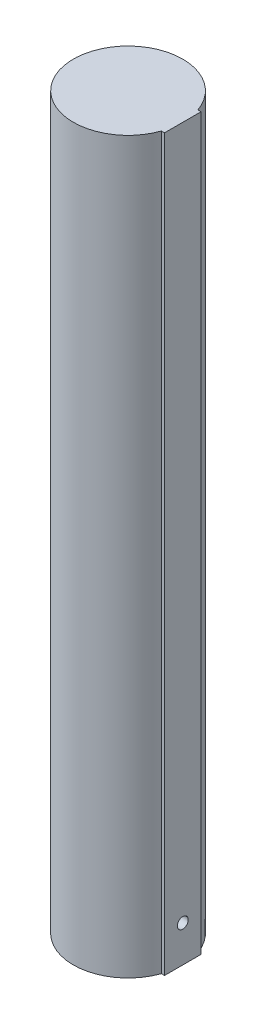
ISO-10303-21;
HEADER;
FILE_DESCRIPTION(('STEP AP214'),'2;1');
FILE_NAME('part.step','',(''),(''),'','','');
FILE_SCHEMA(('AUTOMOTIVE_DESIGN { 1 0 10303 214 1 1 1 1 }'));
ENDSEC;
DATA;
#1=APPLICATION_CONTEXT('core data for automotive mechanical design processes');
#2=APPLICATION_PROTOCOL_DEFINITION('international standard','automotive_design',2000,#1);
#3=PRODUCT_CONTEXT('',#1,'mechanical');
#4=PRODUCT('Part','Part','',(#3));
#5=PRODUCT_RELATED_PRODUCT_CATEGORY('part','',(#4));
#6=PRODUCT_DEFINITION_FORMATION('','',#4);
#7=PRODUCT_DEFINITION_CONTEXT('part definition',#1,'design');
#8=PRODUCT_DEFINITION('design','',#6,#7);
#9=PRODUCT_DEFINITION_SHAPE('','',#8);
#10=(LENGTH_UNIT() NAMED_UNIT(*) SI_UNIT(.MILLI.,.METRE.));
#11=(NAMED_UNIT(*) PLANE_ANGLE_UNIT() SI_UNIT($,.RADIAN.));
#12=(NAMED_UNIT(*) SI_UNIT($,.STERADIAN.) SOLID_ANGLE_UNIT());
#13=UNCERTAINTY_MEASURE_WITH_UNIT(LENGTH_MEASURE(1.E-05),#10,'distance_accuracy_value','');
#14=(GEOMETRIC_REPRESENTATION_CONTEXT(3) GLOBAL_UNCERTAINTY_ASSIGNED_CONTEXT((#13)) GLOBAL_UNIT_ASSIGNED_CONTEXT((#10,
#11,#12)) REPRESENTATION_CONTEXT('',''));
#15=CARTESIAN_POINT('',(0.,0.,0.));
#16=DIRECTION('',(0.,0.,1.));
#17=DIRECTION('',(1.,0.,0.));
#18=AXIS2_PLACEMENT_3D('',#15,#16,#17);
#19=CARTESIAN_POINT('',(1.5,25.,-1.3228756555323));
#20=DIRECTION('',(1.,0.,0.));
#21=DIRECTION('',(0.,0.,-1.));
#22=AXIS2_PLACEMENT_3D('',#19,#20,#21);
#23=PLANE('',#22);
#24=DIRECTION('',(0.,-1.,0.));
#25=VECTOR('',#24,1.);
#26=CARTESIAN_POINT('',(1.5,25.,-1.3228756555323));
#27=LINE('',#26,#25);
#28=CARTESIAN_POINT('',(1.5,25.,-1.3228756555323));
#29=VERTEX_POINT('',#28);
#30=CARTESIAN_POINT('',(1.5,10.7071067811865,-1.32287565553229));
#31=VERTEX_POINT('',#30);
#32=EDGE_CURVE('E127',#29,#31,#27,.T.);
#33=ORIENTED_EDGE('',*,*,#32,.T.);
#34=CARTESIAN_POINT('',(1.5,10.,0.));
#35=DIRECTION('',(1.,0.,0.));
#36=DIRECTION('',(0.,0.,-1.));
#37=AXIS2_PLACEMENT_3D('',#34,#35,#36);
#38=CIRCLE('',#37,1.5);
#39=CARTESIAN_POINT('',(1.5,10.7071067811865,1.3228756555323));
#40=VERTEX_POINT('',#39);
#41=EDGE_CURVE('E11',#31,#40,#38,.T.);
#42=ORIENTED_EDGE('',*,*,#41,.T.);
#43=DIRECTION('',(0.,-1.,0.));
#44=VECTOR('',#43,1.);
#45=CARTESIAN_POINT('',(1.5,25.,1.3228756555323));
#46=LINE('',#45,#44);
#47=CARTESIAN_POINT('',(1.5,25.,1.3228756555323));
#48=VERTEX_POINT('',#47);
#49=EDGE_CURVE('E118',#48,#40,#46,.T.);
#50=ORIENTED_EDGE('',*,*,#49,.F.);
#51=DIRECTION('',(0.,0.,1.));
#52=VECTOR('',#51,1.);
#53=CARTESIAN_POINT('',(1.5,25.,-1.3228756555323));
#54=LINE('',#53,#52);
#55=EDGE_CURVE('E256',#29,#48,#54,.T.);
#56=ORIENTED_EDGE('',*,*,#55,.F.);
#57=EDGE_LOOP('',(#33,#42,#50,#56));
#58=FACE_BOUND('',#57,.T.);
#59=ADVANCED_FACE('F43',(#58),#23,.F.);
#60=CARTESIAN_POINT('',(0.,200.,0.));
#61=DIRECTION('',(0.,-1.,0.));
#62=DIRECTION('',(0.,0.,-1.));
#63=AXIS2_PLACEMENT_3D('',#60,#61,#62);
#64=CYLINDRICAL_SURFACE('',#63,15.);
#65=CARTESIAN_POINT('',(0.,200.,0.));
#66=DIRECTION('',(0.,1.,0.));
#67=DIRECTION('',(0.,0.,1.));
#68=AXIS2_PLACEMENT_3D('',#65,#66,#67);
#69=CIRCLE('',#68,15.);
#70=CARTESIAN_POINT('',(14.142135623731,200.,-5.));
#71=VERTEX_POINT('',#70);
#72=CARTESIAN_POINT('',(14.142135623731,200.,5.));
#73=VERTEX_POINT('',#72);
#74=EDGE_CURVE('E112',#71,#73,#69,.T.);
#75=ORIENTED_EDGE('',*,*,#74,.F.);
#76=DIRECTION('',(0.,1.,0.));
#77=VECTOR('',#76,1.);
#78=CARTESIAN_POINT('',(14.142135623731,0.,-5.));
#79=LINE('',#78,#77);
#80=CARTESIAN_POINT('',(14.142135623731,0.,-5.));
#81=VERTEX_POINT('',#80);
#82=EDGE_CURVE('E157',#81,#71,#79,.T.);
#83=ORIENTED_EDGE('',*,*,#82,.F.);
#84=CARTESIAN_POINT('',(0.,0.,0.));
#85=DIRECTION('',(0.,1.,0.));
#86=DIRECTION('',(0.,0.,1.));
#87=AXIS2_PLACEMENT_3D('',#84,#85,#86);
#88=CIRCLE('',#87,15.);
#89=CARTESIAN_POINT('',(14.142135623731,0.,5.));
#90=VERTEX_POINT('',#89);
#91=EDGE_CURVE('E161',#81,#90,#88,.T.);
#92=ORIENTED_EDGE('',*,*,#91,.T.);
#93=DIRECTION('',(0.,1.,0.));
#94=VECTOR('',#93,1.);
#95=CARTESIAN_POINT('',(14.142135623731,0.,5.));
#96=LINE('',#95,#94);
#97=EDGE_CURVE('E148',#90,#73,#96,.T.);
#98=ORIENTED_EDGE('',*,*,#97,.T.);
#99=EDGE_LOOP('',(#75,#83,#92,#98));
#100=FACE_BOUND('',#99,.T.);
#101=ADVANCED_FACE('F45',(#100),#64,.T.);
#102=CARTESIAN_POINT('',(0.,200.,0.));
#103=DIRECTION('',(0.,1.,0.));
#104=DIRECTION('',(0.,0.,1.));
#105=AXIS2_PLACEMENT_3D('',#102,#103,#104);
#106=PLANE('',#105);
#107=ORIENTED_EDGE('',*,*,#74,.T.);
#108=DIRECTION('',(1.,0.,0.));
#109=VECTOR('',#108,1.);
#110=CARTESIAN_POINT('',(14.142135623731,200.,5.));
#111=LINE('',#110,#109);
#112=CARTESIAN_POINT('',(15.,200.,5.));
#113=VERTEX_POINT('',#112);
#114=EDGE_CURVE('E131',#73,#113,#111,.T.);
#115=ORIENTED_EDGE('',*,*,#114,.T.);
#116=DIRECTION('',(0.,0.,-1.));
#117=VECTOR('',#116,1.);
#118=CARTESIAN_POINT('',(15.,200.,-5.));
#119=LINE('',#118,#117);
#120=CARTESIAN_POINT('',(15.,200.,-5.));
#121=VERTEX_POINT('',#120);
#122=EDGE_CURVE('E152',#113,#121,#119,.T.);
#123=ORIENTED_EDGE('',*,*,#122,.T.);
#124=DIRECTION('',(-1.,0.,0.));
#125=VECTOR('',#124,1.);
#126=CARTESIAN_POINT('',(14.142135623731,200.,-5.));
#127=LINE('',#126,#125);
#128=EDGE_CURVE('E142',#121,#71,#127,.T.);
#129=ORIENTED_EDGE('',*,*,#128,.T.);
#130=EDGE_LOOP('',(#107,#115,#123,#129));
#131=FACE_BOUND('',#130,.T.);
#132=ADVANCED_FACE('F189',(#131),#106,.T.);
#133=CARTESIAN_POINT('',(0.,0.,0.));
#134=DIRECTION('',(0.,1.,0.));
#135=DIRECTION('',(0.,0.,1.));
#136=AXIS2_PLACEMENT_3D('',#133,#134,#135);
#137=PLANE('',#136);
#138=DIRECTION('',(0.,0.,1.));
#139=VECTOR('',#138,1.);
#140=CARTESIAN_POINT('',(1.5,0.,-1.3228756555323));
#141=LINE('',#140,#139);
#142=CARTESIAN_POINT('',(1.5,0.,-1.3228756555323));
#143=VERTEX_POINT('',#142);
#144=CARTESIAN_POINT('',(1.5,0.,1.3228756555323));
#145=VERTEX_POINT('',#144);
#146=EDGE_CURVE('E124',#143,#145,#141,.T.);
#147=ORIENTED_EDGE('',*,*,#146,.F.);
#148=CARTESIAN_POINT('',(0.,0.,0.));
#149=DIRECTION('',(0.,-1.,0.));
#150=DIRECTION('',(0.,0.,-1.));
#151=AXIS2_PLACEMENT_3D('',#148,#149,#150);
#152=CIRCLE('',#151,2.);
#153=EDGE_CURVE('E240',#145,#143,#152,.T.);
#154=ORIENTED_EDGE('',*,*,#153,.F.);
#155=EDGE_LOOP('',(#147,#154));
#156=FACE_BOUND('',#155,.T.);
#157=ORIENTED_EDGE('',*,*,#91,.F.);
#158=DIRECTION('',(-1.,0.,0.));
#159=VECTOR('',#158,1.);
#160=CARTESIAN_POINT('',(14.142135623731,0.,-5.));
#161=LINE('',#160,#159);
#162=CARTESIAN_POINT('',(15.,0.,-5.));
#163=VERTEX_POINT('',#162);
#164=EDGE_CURVE('E145',#163,#81,#161,.T.);
#165=ORIENTED_EDGE('',*,*,#164,.F.);
#166=DIRECTION('',(0.,0.,-1.));
#167=VECTOR('',#166,1.);
#168=CARTESIAN_POINT('',(15.,0.,-5.));
#169=LINE('',#168,#167);
#170=CARTESIAN_POINT('',(15.,0.,5.));
#171=VERTEX_POINT('',#170);
#172=EDGE_CURVE('E141',#171,#163,#169,.T.);
#173=ORIENTED_EDGE('',*,*,#172,.F.);
#174=DIRECTION('',(1.,0.,0.));
#175=VECTOR('',#174,1.);
#176=CARTESIAN_POINT('',(14.142135623731,0.,5.));
#177=LINE('',#176,#175);
#178=EDGE_CURVE('E137',#90,#171,#177,.T.);
#179=ORIENTED_EDGE('',*,*,#178,.F.);
#180=EDGE_LOOP('',(#157,#165,#173,#179));
#181=FACE_BOUND('',#180,.T.);
#182=ADVANCED_FACE('F183',(#156,#181),#137,.F.);
#183=CARTESIAN_POINT('',(15.,0.,-5.));
#184=DIRECTION('',(1.,0.,0.));
#185=DIRECTION('',(0.,0.,-1.));
#186=AXIS2_PLACEMENT_3D('',#183,#184,#185);
#187=PLANE('',#186);
#188=CARTESIAN_POINT('',(15.,10.,0.));
#189=DIRECTION('',(1.,0.,0.));
#190=DIRECTION('',(0.,0.,-1.));
#191=AXIS2_PLACEMENT_3D('',#188,#189,#190);
#192=CIRCLE('',#191,1.5);
#193=CARTESIAN_POINT('',(15.,10.,-1.5));
#194=VERTEX_POINT('',#193);
#195=EDGE_CURVE('E120',#194,#194,#192,.T.);
#196=ORIENTED_EDGE('',*,*,#195,.F.);
#197=EDGE_LOOP('',(#196));
#198=FACE_BOUND('',#197,.T.);
#199=ORIENTED_EDGE('',*,*,#172,.T.);
#200=DIRECTION('',(0.,1.,0.));
#201=VECTOR('',#200,1.);
#202=CARTESIAN_POINT('',(15.,0.,-5.));
#203=LINE('',#202,#201);
#204=EDGE_CURVE('E162',#163,#121,#203,.T.);
#205=ORIENTED_EDGE('',*,*,#204,.T.);
#206=ORIENTED_EDGE('',*,*,#122,.F.);
#207=DIRECTION('',(0.,1.,0.));
#208=VECTOR('',#207,1.);
#209=CARTESIAN_POINT('',(15.,0.,5.));
#210=LINE('',#209,#208);
#211=EDGE_CURVE('E166',#171,#113,#210,.T.);
#212=ORIENTED_EDGE('',*,*,#211,.F.);
#213=EDGE_LOOP('',(#199,#205,#206,#212));
#214=FACE_BOUND('',#213,.T.);
#215=ADVANCED_FACE('F195',(#198,#214),#187,.T.);
#216=CARTESIAN_POINT('',(14.142135623731,0.,-5.));
#217=DIRECTION('',(0.,0.,-1.));
#218=DIRECTION('',(-1.,0.,0.));
#219=AXIS2_PLACEMENT_3D('',#216,#217,#218);
#220=PLANE('',#219);
#221=ORIENTED_EDGE('',*,*,#128,.F.);
#222=ORIENTED_EDGE('',*,*,#204,.F.);
#223=ORIENTED_EDGE('',*,*,#164,.T.);
#224=ORIENTED_EDGE('',*,*,#82,.T.);
#225=EDGE_LOOP('',(#221,#222,#223,#224));
#226=FACE_BOUND('',#225,.T.);
#227=ADVANCED_FACE('F193',(#226),#220,.T.);
#228=CARTESIAN_POINT('',(14.142135623731,0.,5.));
#229=DIRECTION('',(0.,0.,1.));
#230=DIRECTION('',(1.,0.,0.));
#231=AXIS2_PLACEMENT_3D('',#228,#229,#230);
#232=PLANE('',#231);
#233=ORIENTED_EDGE('',*,*,#114,.F.);
#234=ORIENTED_EDGE('',*,*,#97,.F.);
#235=ORIENTED_EDGE('',*,*,#178,.T.);
#236=ORIENTED_EDGE('',*,*,#211,.T.);
#237=EDGE_LOOP('',(#233,#234,#235,#236));
#238=FACE_BOUND('',#237,.T.);
#239=ADVANCED_FACE('F186',(#238),#232,.T.);
#240=CARTESIAN_POINT('',(0.,25.,0.));
#241=DIRECTION('',(0.,-1.,0.));
#242=DIRECTION('',(0.,0.,-1.));
#243=AXIS2_PLACEMENT_3D('',#240,#241,#242);
#244=CYLINDRICAL_SURFACE('',#243,2.);
#245=CARTESIAN_POINT('',(1.5,9.29289321881345,-1.3228756555323));
#246=VERTEX_POINT('',#245);
#247=EDGE_CURVE('E66',#246,#143,#27,.T.);
#248=ORIENTED_EDGE('',*,*,#247,.F.);
#249=CARTESIAN_POINT('',(1.5,9.29289321881345,-1.32287565553229));
#250=CARTESIAN_POINT('',(1.4739145337833,9.34832722563109,-1.35249536626977));
#251=CARTESIAN_POINT('',(1.44894131480395,9.40627389915971,-1.37899373581327));
#252=CARTESIAN_POINT('',(1.40359048884177,9.52745260976207,-1.42512143955085));
#253=CARTESIAN_POINT('',(1.38327621847422,9.5907431108936,-1.44465790144486));
#254=CARTESIAN_POINT('',(1.35027299373116,9.72202263899524,-1.47556624435897));
#255=CARTESIAN_POINT('',(1.33765666230707,9.79004986649171,-1.48686055778082));
#256=CARTESIAN_POINT('',(1.32310580286873,9.92771324059383,-1.49983374673648));
#257=CARTESIAN_POINT('',(1.32109194870825,9.9973335132442,-1.50158403278955));
#258=CARTESIAN_POINT('',(1.32746642679957,10.1249794958398,-1.49593899426719));
#259=CARTESIAN_POINT('',(1.33431678238416,10.1831557673976,-1.48989633105986));
#260=CARTESIAN_POINT('',(1.354748711607,10.2975451511324,-1.47134103673938));
#261=CARTESIAN_POINT('',(1.36836832201381,10.3537452260107,-1.45879182762707));
#262=CARTESIAN_POINT('',(1.40015692782228,10.4615662906112,-1.42829470664003));
#263=CARTESIAN_POINT('',(1.4182014397697,10.5132673778039,-1.4104921818831));
#264=CARTESIAN_POINT('',(1.45725096368967,10.6128886126749,-1.37011445537084));
#265=CARTESIAN_POINT('',(1.47822219020455,10.6608433308559,-1.34759242444094));
#266=CARTESIAN_POINT('',(1.5,10.7071067811865,-1.32287565553229));
#267=B_SPLINE_CURVE_WITH_KNOTS('',3,(#249,#250,#251,#252,#253,#254,#255,#256,#257,#258,#259,
#260,#261,#262,#263,#264,#265,#266),.UNSPECIFIED.,.F.,.F.,(4,2,2,2,2,2,2,2,4),(0.,
0.204432365123609,0.411497905566482,0.620487875617342,0.827911968714584,1.00373614181138,
1.18055964257078,1.35288702776985,1.52336833756426),.UNSPECIFIED.);
#268=EDGE_CURVE('E59',#246,#31,#267,.T.);
#269=ORIENTED_EDGE('',*,*,#268,.T.);
#270=ORIENTED_EDGE('',*,*,#32,.F.);
#271=CARTESIAN_POINT('',(0.,25.,0.));
#272=DIRECTION('',(0.,-1.,0.));
#273=DIRECTION('',(0.,0.,-1.));
#274=AXIS2_PLACEMENT_3D('',#271,#272,#273);
#275=CIRCLE('',#274,2.);
#276=EDGE_CURVE('E241',#48,#29,#275,.T.);
#277=ORIENTED_EDGE('',*,*,#276,.F.);
#278=ORIENTED_EDGE('',*,*,#49,.T.);
#279=CARTESIAN_POINT('',(1.5,10.7071067811865,1.3228756555323));
#280=CARTESIAN_POINT('',(1.4739145337833,10.6516727743689,1.35249536626977));
#281=CARTESIAN_POINT('',(1.44894131480395,10.5937261008403,1.37899373581327));
#282=CARTESIAN_POINT('',(1.40359048884177,10.4725473902379,1.42512143955085));
#283=CARTESIAN_POINT('',(1.38327621847422,10.4092568891064,1.44465790144486));
#284=CARTESIAN_POINT('',(1.35027299373116,10.2779773610048,1.47556624435897));
#285=CARTESIAN_POINT('',(1.33765666230707,10.2099501335083,1.48686055778082));
#286=CARTESIAN_POINT('',(1.32310580286873,10.0722867594062,1.49983374673648));
#287=CARTESIAN_POINT('',(1.32109194870825,10.0026664867558,1.50158403278955));
#288=CARTESIAN_POINT('',(1.32746642679957,9.87502050416024,1.49593899426719));
#289=CARTESIAN_POINT('',(1.33431678238416,9.81684423260236,1.48989633105986));
#290=CARTESIAN_POINT('',(1.354748711607,9.70245484886757,1.47134103673938));
#291=CARTESIAN_POINT('',(1.36836832201381,9.64625477398929,1.45879182762707));
#292=CARTESIAN_POINT('',(1.40015692782228,9.53843370938881,1.42829470664004));
#293=CARTESIAN_POINT('',(1.4182014397697,9.48673262219608,1.4104921818831));
#294=CARTESIAN_POINT('',(1.45725096368967,9.38711138732506,1.37011445537084));
#295=CARTESIAN_POINT('',(1.47822219020455,9.33915666914407,1.34759242444094));
#296=CARTESIAN_POINT('',(1.5,9.29289321881345,1.32287565553229));
#297=B_SPLINE_CURVE_WITH_KNOTS('',3,(#279,#280,#281,#282,#283,#284,#285,#286,#287,#288,#289,
#290,#291,#292,#293,#294,#295,#296),.UNSPECIFIED.,.F.,.F.,(4,2,2,2,2,2,2,2,4),(0.,
0.204432365123608,0.41149790556648,0.620487875617338,0.827911968714583,1.00373614181138,
1.18055964257078,1.35288702776985,1.52336833756426),.UNSPECIFIED.);
#298=CARTESIAN_POINT('',(1.5,9.29289321881345,1.3228756555323));
#299=VERTEX_POINT('',#298);
#300=EDGE_CURVE('E109',#40,#299,#297,.T.);
#301=ORIENTED_EDGE('',*,*,#300,.T.);
#302=EDGE_CURVE('E116',#299,#145,#46,.T.);
#303=ORIENTED_EDGE('',*,*,#302,.T.);
#304=ORIENTED_EDGE('',*,*,#153,.T.);
#305=EDGE_LOOP('',(#248,#269,#270,#277,#278,#301,#303,#304));
#306=FACE_BOUND('',#305,.T.);
#307=ADVANCED_FACE('F115',(#306),#244,.F.);
#308=ORIENTED_EDGE('',*,*,#302,.F.);
#309=EDGE_CURVE('E47',#299,#246,#38,.T.);
#310=ORIENTED_EDGE('',*,*,#309,.T.);
#311=ORIENTED_EDGE('',*,*,#247,.T.);
#312=ORIENTED_EDGE('',*,*,#146,.T.);
#313=EDGE_LOOP('',(#308,#310,#311,#312));
#314=FACE_BOUND('',#313,.T.);
#315=ADVANCED_FACE('F122',(#314),#23,.F.);
#316=CARTESIAN_POINT('',(0.,25.,0.));
#317=DIRECTION('',(0.,-1.,0.));
#318=DIRECTION('',(0.,0.,-1.));
#319=AXIS2_PLACEMENT_3D('',#316,#317,#318);
#320=PLANE('',#319);
#321=ORIENTED_EDGE('',*,*,#276,.T.);
#322=ORIENTED_EDGE('',*,*,#55,.T.);
#323=EDGE_LOOP('',(#321,#322));
#324=FACE_BOUND('',#323,.T.);
#325=ADVANCED_FACE('F216',(#324),#320,.T.);
#326=CARTESIAN_POINT('',(0.,10.,0.));
#327=DIRECTION('',(1.,0.,0.));
#328=DIRECTION('',(0.,0.,-1.));
#329=AXIS2_PLACEMENT_3D('',#326,#327,#328);
#330=CYLINDRICAL_SURFACE('',#329,1.5);
#331=ORIENTED_EDGE('',*,*,#195,.T.);
#332=EDGE_LOOP('',(#331));
#333=FACE_BOUND('',#332,.T.);
#334=ORIENTED_EDGE('',*,*,#268,.F.);
#335=ORIENTED_EDGE('',*,*,#309,.F.);
#336=ORIENTED_EDGE('',*,*,#300,.F.);
#337=ORIENTED_EDGE('',*,*,#41,.F.);
#338=EDGE_LOOP('',(#334,#335,#336,#337));
#339=FACE_BOUND('',#338,.T.);
#340=ADVANCED_FACE('F108',(#333,#339),#330,.F.);
#341=CLOSED_SHELL('',(#59,#101,#132,#182,#215,#227,#239,#307,#315,#325,#340));
#342=MANIFOLD_SOLID_BREP('B2',#341);
#343=ADVANCED_BREP_SHAPE_REPRESENTATION('',(#18,#342),#14);
#344=SHAPE_DEFINITION_REPRESENTATION(#9,#343);
ENDSEC;
END-ISO-10303-21;
